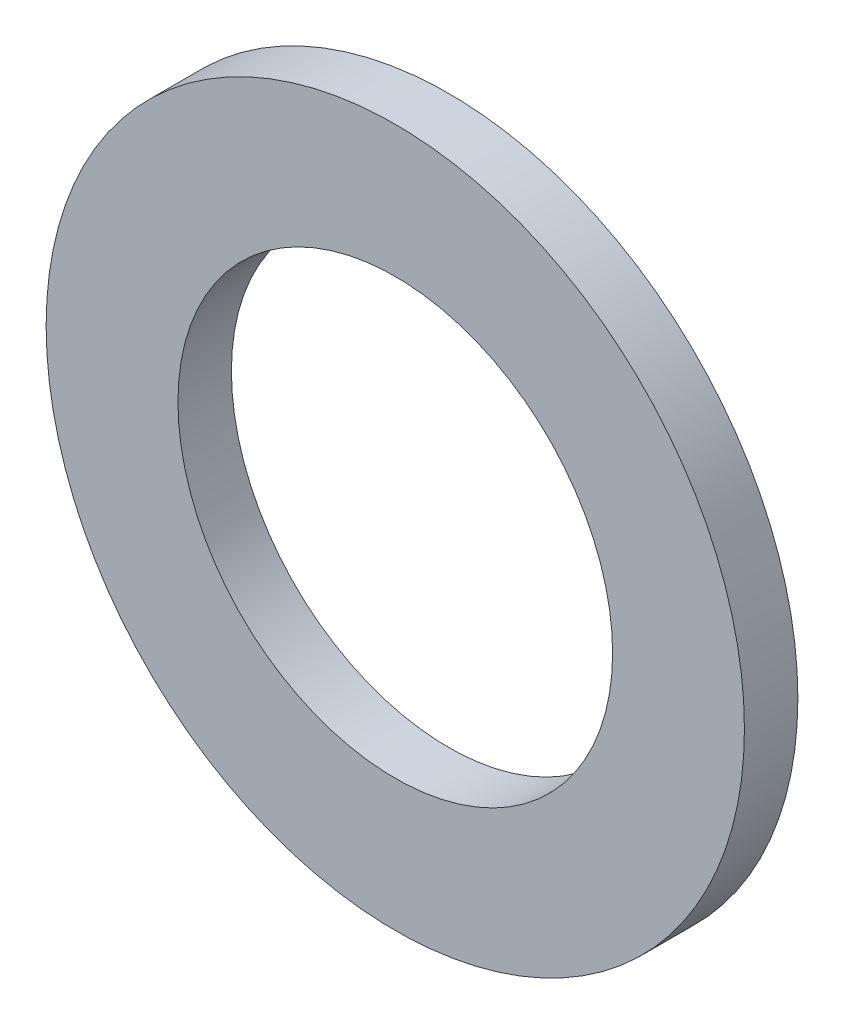
ISO-10303-21;
HEADER;
FILE_DESCRIPTION(('STEP AP214'),'2;1');
FILE_NAME('part.step','',(''),(''),'','','');
FILE_SCHEMA(('AUTOMOTIVE_DESIGN { 1 0 10303 214 1 1 1 1 }'));
ENDSEC;
DATA;
#1=APPLICATION_CONTEXT('core data for automotive mechanical design processes');
#2=APPLICATION_PROTOCOL_DEFINITION('international standard','automotive_design',2000,#1);
#3=PRODUCT_CONTEXT('',#1,'mechanical');
#4=PRODUCT('Part','Part','',(#3));
#5=PRODUCT_RELATED_PRODUCT_CATEGORY('part','',(#4));
#6=PRODUCT_DEFINITION_FORMATION('','',#4);
#7=PRODUCT_DEFINITION_CONTEXT('part definition',#1,'design');
#8=PRODUCT_DEFINITION('design','',#6,#7);
#9=PRODUCT_DEFINITION_SHAPE('','',#8);
#10=(LENGTH_UNIT() NAMED_UNIT(*) SI_UNIT(.MILLI.,.METRE.));
#11=(NAMED_UNIT(*) PLANE_ANGLE_UNIT() SI_UNIT($,.RADIAN.));
#12=(NAMED_UNIT(*) SI_UNIT($,.STERADIAN.) SOLID_ANGLE_UNIT());
#13=UNCERTAINTY_MEASURE_WITH_UNIT(LENGTH_MEASURE(1.E-05),#10,'distance_accuracy_value','');
#14=(GEOMETRIC_REPRESENTATION_CONTEXT(3) GLOBAL_UNCERTAINTY_ASSIGNED_CONTEXT((#13)) GLOBAL_UNIT_ASSIGNED_CONTEXT((#10,
#11,#12)) REPRESENTATION_CONTEXT('',''));
#15=CARTESIAN_POINT('',(0.,0.,0.));
#16=DIRECTION('',(0.,0.,1.));
#17=DIRECTION('',(1.,0.,0.));
#18=AXIS2_PLACEMENT_3D('',#15,#16,#17);
#19=CARTESIAN_POINT('',(0.,0.,0.));
#20=DIRECTION('',(0.,0.,1.));
#21=DIRECTION('',(1.,0.,0.));
#22=AXIS2_PLACEMENT_3D('',#19,#20,#21);
#23=PLANE('',#22);
#24=CARTESIAN_POINT('',(0.,0.,0.));
#25=DIRECTION('',(0.,0.,1.));
#26=DIRECTION('',(1.,0.,0.));
#27=AXIS2_PLACEMENT_3D('',#24,#25,#26);
#28=CIRCLE('',#27,9.80000000000005);
#29=CARTESIAN_POINT('',(9.80000000000005,0.,0.));
#30=VERTEX_POINT('',#29);
#31=EDGE_CURVE('E38',#30,#30,#28,.T.);
#32=ORIENTED_EDGE('',*,*,#31,.F.);
#33=EDGE_LOOP('',(#32));
#34=FACE_BOUND('',#33,.T.);
#35=CARTESIAN_POINT('',(0.,0.,0.));
#36=DIRECTION('',(0.,0.,1.));
#37=DIRECTION('',(1.,0.,0.));
#38=AXIS2_PLACEMENT_3D('',#35,#36,#37);
#39=CIRCLE('',#38,6.10000000000003);
#40=CARTESIAN_POINT('',(6.10000000000003,0.,0.));
#41=VERTEX_POINT('',#40);
#42=EDGE_CURVE('E47',#41,#41,#39,.T.);
#43=ORIENTED_EDGE('',*,*,#42,.T.);
#44=EDGE_LOOP('',(#43));
#45=FACE_BOUND('',#44,.T.);
#46=ADVANCED_FACE('F31',(#34,#45),#23,.F.);
#47=CARTESIAN_POINT('',(0.,0.,29.2185858225142));
#48=DIRECTION('',(0.,0.,-1.));
#49=DIRECTION('',(-1.,0.,0.));
#50=AXIS2_PLACEMENT_3D('',#47,#48,#49);
#51=CYLINDRICAL_SURFACE('',#50,9.80000000000005);
#52=CARTESIAN_POINT('',(0.,0.,1.50000000000143));
#53=DIRECTION('',(0.,0.,-1.));
#54=DIRECTION('',(-1.,0.,0.));
#55=AXIS2_PLACEMENT_3D('',#52,#53,#54);
#56=CIRCLE('',#55,9.80000000000005);
#57=CARTESIAN_POINT('',(-9.80000000000005,0.,1.50000000000142));
#58=VERTEX_POINT('',#57);
#59=EDGE_CURVE('E42',#58,#58,#56,.T.);
#60=ORIENTED_EDGE('',*,*,#59,.T.);
#61=EDGE_LOOP('',(#60));
#62=FACE_BOUND('',#61,.T.);
#63=ORIENTED_EDGE('',*,*,#31,.T.);
#64=EDGE_LOOP('',(#63));
#65=FACE_BOUND('',#64,.T.);
#66=ADVANCED_FACE('F55',(#62,#65),#51,.T.);
#67=CARTESIAN_POINT('',(0.,0.,29.2185858225142));
#68=DIRECTION('',(0.,0.,-1.));
#69=DIRECTION('',(-1.,0.,0.));
#70=AXIS2_PLACEMENT_3D('',#67,#68,#69);
#71=CYLINDRICAL_SURFACE('',#70,6.10000000000003);
#72=CARTESIAN_POINT('',(0.,0.,1.50000000000143));
#73=DIRECTION('',(0.,0.,-1.));
#74=DIRECTION('',(-1.,0.,0.));
#75=AXIS2_PLACEMENT_3D('',#72,#73,#74);
#76=CIRCLE('',#75,6.10000000000003);
#77=CARTESIAN_POINT('',(-6.10000000000003,0.,1.50000000000143));
#78=VERTEX_POINT('',#77);
#79=EDGE_CURVE('E10',#78,#78,#76,.T.);
#80=ORIENTED_EDGE('',*,*,#79,.F.);
#81=EDGE_LOOP('',(#80));
#82=FACE_BOUND('',#81,.T.);
#83=ORIENTED_EDGE('',*,*,#42,.F.);
#84=EDGE_LOOP('',(#83));
#85=FACE_BOUND('',#84,.T.);
#86=ADVANCED_FACE('F53',(#82,#85),#71,.F.);
#87=CARTESIAN_POINT('',(-6.53843298947798E-11,3.03958247460656E-11,1.50000000000143));
#88=DIRECTION('',(0.,0.,-1.));
#89=DIRECTION('',(0.811012635298571,0.585028636381218,0.));
#90=AXIS2_PLACEMENT_3D('',#87,#88,#89);
#91=PLANE('',#90);
#92=ORIENTED_EDGE('',*,*,#79,.T.);
#93=EDGE_LOOP('',(#92));
#94=FACE_BOUND('',#93,.T.);
#95=ORIENTED_EDGE('',*,*,#59,.F.);
#96=EDGE_LOOP('',(#95));
#97=FACE_BOUND('',#96,.T.);
#98=ADVANCED_FACE('F33',(#94,#97),#91,.F.);
#99=CLOSED_SHELL('',(#46,#66,#86,#98));
#100=MANIFOLD_SOLID_BREP('B2',#99);
#101=ADVANCED_BREP_SHAPE_REPRESENTATION('',(#18,#100),#14);
#102=SHAPE_DEFINITION_REPRESENTATION(#9,#101);
ENDSEC;
END-ISO-10303-21;
